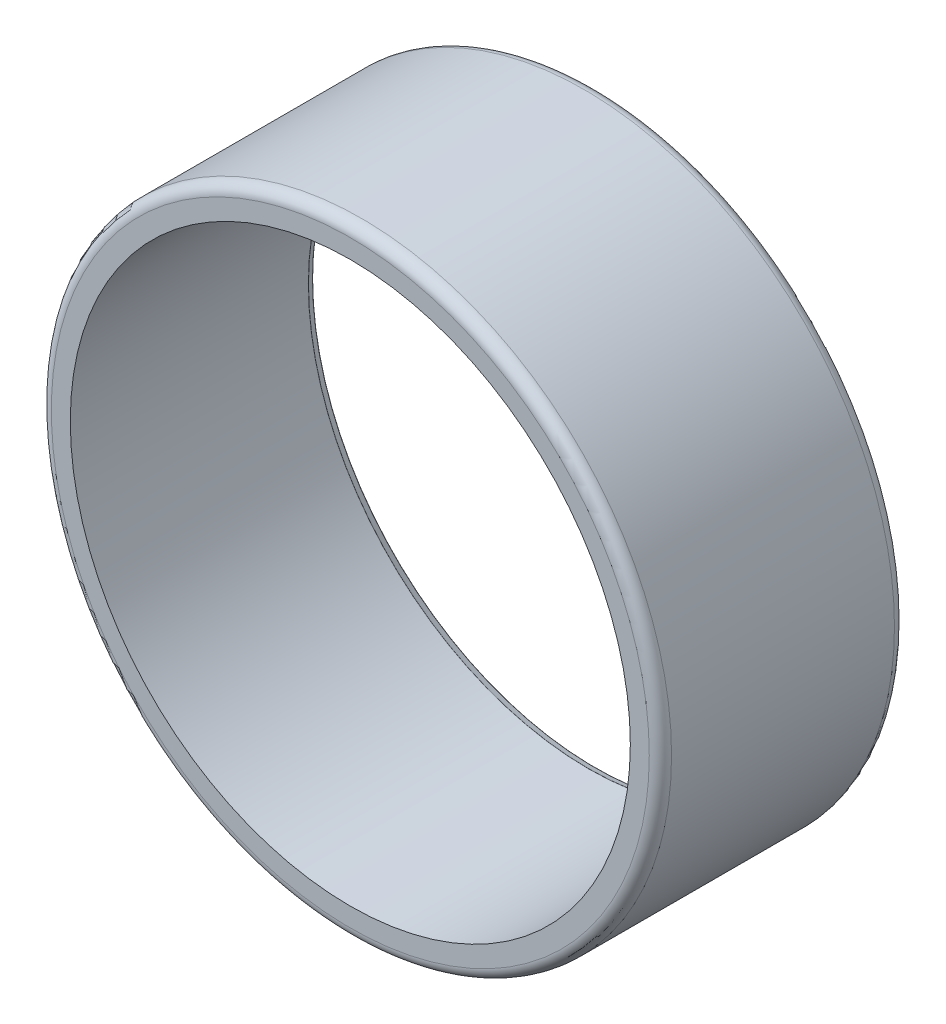
ISO-10303-21;
HEADER;
FILE_DESCRIPTION(('STEP AP214'),'2;1');
FILE_NAME('part.step','',(''),(''),'','','');
FILE_SCHEMA(('AUTOMOTIVE_DESIGN { 1 0 10303 214 1 1 1 1 }'));
ENDSEC;
DATA;
#1=APPLICATION_CONTEXT('core data for automotive mechanical design processes');
#2=APPLICATION_PROTOCOL_DEFINITION('international standard','automotive_design',2000,#1);
#3=PRODUCT_CONTEXT('',#1,'mechanical');
#4=PRODUCT('Part','Part','',(#3));
#5=PRODUCT_RELATED_PRODUCT_CATEGORY('part','',(#4));
#6=PRODUCT_DEFINITION_FORMATION('','',#4);
#7=PRODUCT_DEFINITION_CONTEXT('part definition',#1,'design');
#8=PRODUCT_DEFINITION('design','',#6,#7);
#9=PRODUCT_DEFINITION_SHAPE('','',#8);
#10=(LENGTH_UNIT() NAMED_UNIT(*) SI_UNIT(.MILLI.,.METRE.));
#11=(NAMED_UNIT(*) PLANE_ANGLE_UNIT() SI_UNIT($,.RADIAN.));
#12=(NAMED_UNIT(*) SI_UNIT($,.STERADIAN.) SOLID_ANGLE_UNIT());
#13=UNCERTAINTY_MEASURE_WITH_UNIT(LENGTH_MEASURE(1.E-05),#10,'distance_accuracy_value','');
#14=(GEOMETRIC_REPRESENTATION_CONTEXT(3) GLOBAL_UNCERTAINTY_ASSIGNED_CONTEXT((#13)) GLOBAL_UNIT_ASSIGNED_CONTEXT((#10,
#11,#12)) REPRESENTATION_CONTEXT('',''));
#15=CARTESIAN_POINT('',(0.,0.,0.));
#16=DIRECTION('',(0.,0.,1.));
#17=DIRECTION('',(1.,0.,0.));
#18=AXIS2_PLACEMENT_3D('',#15,#16,#17);
#19=CARTESIAN_POINT('',(0.,0.,-9.99999999999999));
#20=DIRECTION('',(0.,0.,1.));
#21=DIRECTION('',(1.,0.,0.));
#22=AXIS2_PLACEMENT_3D('',#19,#20,#21);
#23=TOROIDAL_SURFACE('',#22,26.825,1.);
#24=CARTESIAN_POINT('',(0.,0.,-11.));
#25=DIRECTION('',(0.,0.,1.));
#26=DIRECTION('',(1.,0.,0.));
#27=AXIS2_PLACEMENT_3D('',#24,#25,#26);
#28=CIRCLE('',#27,26.825);
#29=CARTESIAN_POINT('',(26.825,0.,-11.));
#30=VERTEX_POINT('',#29);
#31=EDGE_CURVE('E96',#30,#30,#28,.T.);
#32=ORIENTED_EDGE('',*,*,#31,.T.);
#33=EDGE_LOOP('',(#32));
#34=FACE_BOUND('',#33,.T.);
#35=CARTESIAN_POINT('',(0.,0.,-9.99999999999999));
#36=DIRECTION('',(0.,0.,1.));
#37=DIRECTION('',(1.,0.,0.));
#38=AXIS2_PLACEMENT_3D('',#35,#36,#37);
#39=CIRCLE('',#38,27.825);
#40=CARTESIAN_POINT('',(27.825,0.,-9.99999999999999));
#41=VERTEX_POINT('',#40);
#42=EDGE_CURVE('E81',#41,#41,#39,.T.);
#43=ORIENTED_EDGE('',*,*,#42,.F.);
#44=EDGE_LOOP('',(#43));
#45=FACE_BOUND('',#44,.T.);
#46=ADVANCED_FACE('F53',(#34,#45),#23,.T.);
#47=CARTESIAN_POINT('',(0.,0.,55.));
#48=DIRECTION('',(0.,0.,1.));
#49=DIRECTION('',(1.,0.,0.));
#50=AXIS2_PLACEMENT_3D('',#47,#48,#49);
#51=CYLINDRICAL_SURFACE('',#50,27.825);
#52=ORIENTED_EDGE('',*,*,#42,.T.);
#53=EDGE_LOOP('',(#52));
#54=FACE_BOUND('',#53,.T.);
#55=CARTESIAN_POINT('',(0.,0.,10.));
#56=DIRECTION('',(0.,0.,1.));
#57=DIRECTION('',(1.,0.,0.));
#58=AXIS2_PLACEMENT_3D('',#55,#56,#57);
#59=CIRCLE('',#58,27.825);
#60=CARTESIAN_POINT('',(27.825,0.,10.));
#61=VERTEX_POINT('',#60);
#62=EDGE_CURVE('E85',#61,#61,#59,.T.);
#63=ORIENTED_EDGE('',*,*,#62,.F.);
#64=EDGE_LOOP('',(#63));
#65=FACE_BOUND('',#64,.T.);
#66=ADVANCED_FACE('F116',(#54,#65),#51,.T.);
#67=CARTESIAN_POINT('',(0.,0.,10.));
#68=DIRECTION('',(0.,0.,1.));
#69=DIRECTION('',(1.,0.,0.));
#70=AXIS2_PLACEMENT_3D('',#67,#68,#69);
#71=TOROIDAL_SURFACE('',#70,26.825,1.);
#72=CARTESIAN_POINT('',(0.,0.,11.));
#73=DIRECTION('',(0.,0.,1.));
#74=DIRECTION('',(1.,0.,0.));
#75=AXIS2_PLACEMENT_3D('',#72,#73,#74);
#76=CIRCLE('',#75,26.825);
#77=CARTESIAN_POINT('',(26.825,0.,11.));
#78=VERTEX_POINT('',#77);
#79=EDGE_CURVE('E88',#78,#78,#76,.T.);
#80=ORIENTED_EDGE('',*,*,#79,.F.);
#81=EDGE_LOOP('',(#80));
#82=FACE_BOUND('',#81,.T.);
#83=ORIENTED_EDGE('',*,*,#62,.T.);
#84=EDGE_LOOP('',(#83));
#85=FACE_BOUND('',#84,.T.);
#86=ADVANCED_FACE('F120',(#82,#85),#71,.T.);
#87=CARTESIAN_POINT('',(0.,0.,11.));
#88=DIRECTION('',(0.,0.,-1.));
#89=DIRECTION('',(-1.,0.,0.));
#90=AXIS2_PLACEMENT_3D('',#87,#88,#89);
#91=PLANE('',#90);
#92=CARTESIAN_POINT('',(0.,0.,11.));
#93=DIRECTION('',(0.,0.,1.));
#94=DIRECTION('',(1.,0.,0.));
#95=AXIS2_PLACEMENT_3D('',#92,#93,#94);
#96=CIRCLE('',#95,25.125);
#97=CARTESIAN_POINT('',(25.125,0.,11.));
#98=VERTEX_POINT('',#97);
#99=EDGE_CURVE('E92',#98,#98,#96,.T.);
#100=ORIENTED_EDGE('',*,*,#99,.F.);
#101=EDGE_LOOP('',(#100));
#102=FACE_BOUND('',#101,.T.);
#103=ORIENTED_EDGE('',*,*,#79,.T.);
#104=EDGE_LOOP('',(#103));
#105=FACE_BOUND('',#104,.T.);
#106=ADVANCED_FACE('F126',(#102,#105),#91,.F.);
#107=CARTESIAN_POINT('',(0.,0.,55.));
#108=DIRECTION('',(0.,0.,1.));
#109=DIRECTION('',(1.,0.,0.));
#110=AXIS2_PLACEMENT_3D('',#107,#108,#109);
#111=CYLINDRICAL_SURFACE('',#110,25.125);
#112=CARTESIAN_POINT('',(0.,0.,-10.3504474954546));
#113=DIRECTION('',(0.,0.,-1.));
#114=DIRECTION('',(-1.,0.,0.));
#115=AXIS2_PLACEMENT_3D('',#112,#113,#114);
#116=CIRCLE('',#115,25.125);
#117=CARTESIAN_POINT('',(-25.125,0.,-10.3504474954546));
#118=VERTEX_POINT('',#117);
#119=EDGE_CURVE('E61',#118,#118,#116,.T.);
#120=ORIENTED_EDGE('',*,*,#119,.T.);
#121=EDGE_LOOP('',(#120));
#122=FACE_BOUND('',#121,.T.);
#123=ORIENTED_EDGE('',*,*,#99,.T.);
#124=EDGE_LOOP('',(#123));
#125=FACE_BOUND('',#124,.T.);
#126=ADVANCED_FACE('F112',(#122,#125),#111,.F.);
#127=CARTESIAN_POINT('',(0.,0.,-10.3680801935254));
#128=DIRECTION('',(0.,0.,-1.));
#129=DIRECTION('',(-1.,0.,0.));
#130=AXIS2_PLACEMENT_3D('',#127,#128,#129);
#131=CONICAL_SURFACE('',#130,25.125,0.349065850398868);
#132=CARTESIAN_POINT('',(0.,0.,-10.3846495097872));
#133=DIRECTION('',(0.,0.,1.));
#134=DIRECTION('',(1.,0.,0.));
#135=AXIS2_PLACEMENT_3D('',#132,#133,#134);
#136=CIRCLE('',#135,25.1310307379214);
#137=CARTESIAN_POINT('',(25.1310307379214,0.,-10.3846495097872));
#138=VERTEX_POINT('',#137);
#139=EDGE_CURVE('E69',#138,#138,#136,.T.);
#140=ORIENTED_EDGE('',*,*,#139,.T.);
#141=EDGE_LOOP('',(#140));
#142=FACE_BOUND('',#141,.T.);
#143=CARTESIAN_POINT('',(0.,0.,-10.9342020143326));
#144=DIRECTION('',(0.,0.,-1.));
#145=DIRECTION('',(-1.,0.,0.));
#146=AXIS2_PLACEMENT_3D('',#143,#144,#145);
#147=CIRCLE('',#146,25.3310514917424);
#148=CARTESIAN_POINT('',(-25.3310514917424,0.,-10.9342020143326));
#149=VERTEX_POINT('',#148);
#150=EDGE_CURVE('E75',#149,#149,#147,.T.);
#151=ORIENTED_EDGE('',*,*,#150,.T.);
#152=EDGE_LOOP('',(#151));
#153=FACE_BOUND('',#152,.T.);
#154=ADVANCED_FACE('F106',(#142,#153),#131,.F.);
#155=CARTESIAN_POINT('',(0.,0.,-11.));
#156=DIRECTION('',(0.,0.,-1.));
#157=DIRECTION('',(-1.,0.,0.));
#158=AXIS2_PLACEMENT_3D('',#155,#156,#157);
#159=PLANE('',#158);
#160=CARTESIAN_POINT('',(0.,0.,-11.));
#161=DIRECTION('',(0.,0.,-1.));
#162=DIRECTION('',(-1.,0.,0.));
#163=AXIS2_PLACEMENT_3D('',#160,#161,#162);
#164=CIRCLE('',#163,25.425020753821);
#165=CARTESIAN_POINT('',(-25.425020753821,0.,-11.));
#166=VERTEX_POINT('',#165);
#167=EDGE_CURVE('E10',#166,#166,#164,.F.);
#168=ORIENTED_EDGE('',*,*,#167,.T.);
#169=EDGE_LOOP('',(#168));
#170=FACE_BOUND('',#169,.T.);
#171=ORIENTED_EDGE('',*,*,#31,.F.);
#172=EDGE_LOOP('',(#171));
#173=FACE_BOUND('',#172,.T.);
#174=ADVANCED_FACE('F103',(#170,#173),#159,.T.);
#175=CARTESIAN_POINT('',(0.,0.,-10.3504474954546));
#176=DIRECTION('',(0.,0.,-1.));
#177=DIRECTION('',(-1.,0.,0.));
#178=AXIS2_PLACEMENT_3D('',#175,#176,#177);
#179=TOROIDAL_SURFACE('',#178,25.225,0.1);
#180=ORIENTED_EDGE('',*,*,#119,.F.);
#181=EDGE_LOOP('',(#180));
#182=FACE_BOUND('',#181,.T.);
#183=ORIENTED_EDGE('',*,*,#139,.F.);
#184=EDGE_LOOP('',(#183));
#185=FACE_BOUND('',#184,.T.);
#186=ADVANCED_FACE('F105',(#182,#185),#179,.T.);
#187=CARTESIAN_POINT('',(0.,0.,-10.9));
#188=DIRECTION('',(0.,0.,-1.));
#189=DIRECTION('',(-1.,0.,0.));
#190=AXIS2_PLACEMENT_3D('',#187,#188,#189);
#191=TOROIDAL_SURFACE('',#190,25.425020753821,0.1);
#192=ORIENTED_EDGE('',*,*,#150,.F.);
#193=EDGE_LOOP('',(#192));
#194=FACE_BOUND('',#193,.T.);
#195=ORIENTED_EDGE('',*,*,#167,.F.);
#196=EDGE_LOOP('',(#195));
#197=FACE_BOUND('',#196,.T.);
#198=ADVANCED_FACE('F55',(#194,#197),#191,.T.);
#199=CLOSED_SHELL('',(#46,#66,#86,#106,#126,#154,#174,#186,#198));
#200=MANIFOLD_SOLID_BREP('B2',#199);
#201=ADVANCED_BREP_SHAPE_REPRESENTATION('',(#18,#200),#14);
#202=SHAPE_DEFINITION_REPRESENTATION(#9,#201);
ENDSEC;
END-ISO-10303-21;
